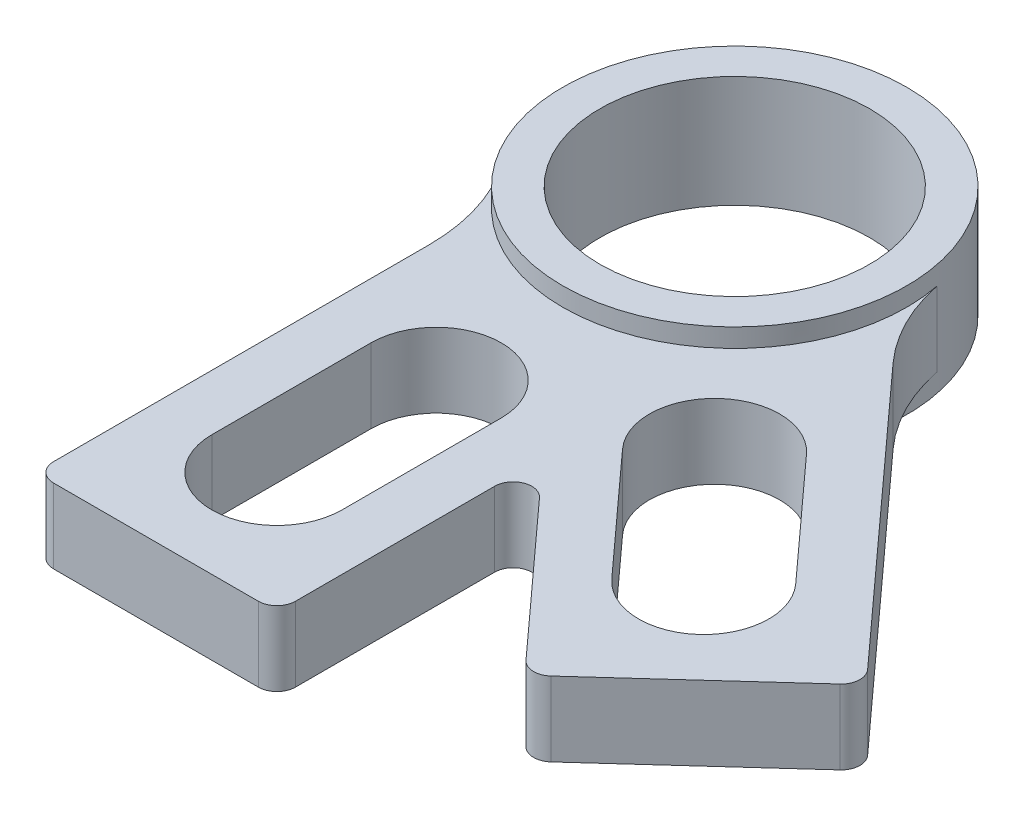
ISO-10303-21;
HEADER;
FILE_DESCRIPTION(('STEP AP214'),'2;1');
FILE_NAME('part.step','',(''),(''),'','','');
FILE_SCHEMA(('AUTOMOTIVE_DESIGN { 1 0 10303 214 1 1 1 1 }'));
ENDSEC;
DATA;
#1=APPLICATION_CONTEXT('core data for automotive mechanical design processes');
#2=APPLICATION_PROTOCOL_DEFINITION('international standard','automotive_design',2000,#1);
#3=PRODUCT_CONTEXT('',#1,'mechanical');
#4=PRODUCT('Part','Part','',(#3));
#5=PRODUCT_RELATED_PRODUCT_CATEGORY('part','',(#4));
#6=PRODUCT_DEFINITION_FORMATION('','',#4);
#7=PRODUCT_DEFINITION_CONTEXT('part definition',#1,'design');
#8=PRODUCT_DEFINITION('design','',#6,#7);
#9=PRODUCT_DEFINITION_SHAPE('','',#8);
#10=(LENGTH_UNIT() NAMED_UNIT(*) SI_UNIT(.MILLI.,.METRE.));
#11=(NAMED_UNIT(*) PLANE_ANGLE_UNIT() SI_UNIT($,.RADIAN.));
#12=(NAMED_UNIT(*) SI_UNIT($,.STERADIAN.) SOLID_ANGLE_UNIT());
#13=UNCERTAINTY_MEASURE_WITH_UNIT(LENGTH_MEASURE(1.E-05),#10,'distance_accuracy_value','');
#14=(GEOMETRIC_REPRESENTATION_CONTEXT(3) GLOBAL_UNCERTAINTY_ASSIGNED_CONTEXT((#13)) GLOBAL_UNIT_ASSIGNED_CONTEXT((#10,
#11,#12)) REPRESENTATION_CONTEXT('',''));
#15=CARTESIAN_POINT('',(0.,0.,0.));
#16=DIRECTION('',(0.,0.,1.));
#17=DIRECTION('',(1.,0.,0.));
#18=AXIS2_PLACEMENT_3D('',#15,#16,#17);
#19=CARTESIAN_POINT('',(0.,4.7625,0.));
#20=DIRECTION('',(0.,-1.,0.));
#21=DIRECTION('',(0.,0.,-1.));
#22=AXIS2_PLACEMENT_3D('',#19,#20,#21);
#23=CYLINDRICAL_SURFACE('',#22,11.5062);
#24=CARTESIAN_POINT('',(0.,4.7625,0.));
#25=DIRECTION('',(0.,1.,0.));
#26=DIRECTION('',(0.,0.,1.));
#27=AXIS2_PLACEMENT_3D('',#24,#25,#26);
#28=CIRCLE('',#27,11.5062);
#29=CARTESIAN_POINT('',(0.,4.7625,-11.5062));
#30=VERTEX_POINT('',#29);
#31=EDGE_CURVE('E301',#30,#30,#28,.T.);
#32=CARTESIAN_POINT('',(0.,-4.7625,0.));
#33=DIRECTION('',(0.,1.,0.));
#34=DIRECTION('',(0.,0.,1.));
#35=AXIS2_PLACEMENT_3D('',#32,#33,#34);
#36=CIRCLE('',#35,11.5062);
#37=CARTESIAN_POINT('',(0.,-4.7625,-11.5062));
#38=VERTEX_POINT('',#37);
#39=EDGE_CURVE('E296',#38,#38,#36,.T.);
#40=CARTESIAN_POINT('',(0.,4.7625,-11.5062));
#41=CARTESIAN_POINT('',(0.,4.66328125,-11.5062));
#42=CARTESIAN_POINT('',(0.,4.5640625,-11.5062));
#43=CARTESIAN_POINT('',(0.,4.365625,-11.5062));
#44=CARTESIAN_POINT('',(0.,4.26640625,-11.5062));
#45=CARTESIAN_POINT('',(0.,4.06796875,-11.5062));
#46=CARTESIAN_POINT('',(0.,3.96875,-11.5062));
#47=CARTESIAN_POINT('',(0.,3.7703125,-11.5062));
#48=CARTESIAN_POINT('',(0.,3.67109375,-11.5062));
#49=CARTESIAN_POINT('',(0.,3.47265625,-11.5062));
#50=CARTESIAN_POINT('',(0.,3.3734375,-11.5062));
#51=CARTESIAN_POINT('',(0.,3.175,-11.5062));
#52=CARTESIAN_POINT('',(0.,3.07578125,-11.5062));
#53=CARTESIAN_POINT('',(0.,2.87734375,-11.5062));
#54=CARTESIAN_POINT('',(0.,2.778125,-11.5062));
#55=CARTESIAN_POINT('',(0.,2.5796875,-11.5062));
#56=CARTESIAN_POINT('',(0.,2.48046875,-11.5062));
#57=CARTESIAN_POINT('',(0.,2.28203125,-11.5062));
#58=CARTESIAN_POINT('',(0.,2.1828125,-11.5062));
#59=CARTESIAN_POINT('',(0.,1.984375,-11.5062));
#60=CARTESIAN_POINT('',(0.,1.88515625,-11.5062));
#61=CARTESIAN_POINT('',(0.,1.68671875,-11.5062));
#62=CARTESIAN_POINT('',(0.,1.5875,-11.5062));
#63=CARTESIAN_POINT('',(0.,1.3890625,-11.5062));
#64=CARTESIAN_POINT('',(0.,1.28984375,-11.5062));
#65=CARTESIAN_POINT('',(0.,1.09140625,-11.5062));
#66=CARTESIAN_POINT('',(0.,0.992187499999999,-11.5062));
#67=CARTESIAN_POINT('',(0.,0.79375,-11.5062));
#68=CARTESIAN_POINT('',(0.,0.69453125,-11.5062));
#69=CARTESIAN_POINT('',(0.,0.49609375,-11.5062));
#70=CARTESIAN_POINT('',(0.,0.396875,-11.5062));
#71=CARTESIAN_POINT('',(0.,0.1984375,-11.5062));
#72=CARTESIAN_POINT('',(0.,0.0992187500000001,-11.5062));
#73=CARTESIAN_POINT('',(0.,-0.0992187500000001,-11.5062));
#74=CARTESIAN_POINT('',(0.,-0.1984375,-11.5062));
#75=CARTESIAN_POINT('',(0.,-0.396875,-11.5062));
#76=CARTESIAN_POINT('',(0.,-0.49609375,-11.5062));
#77=CARTESIAN_POINT('',(0.,-0.69453125,-11.5062));
#78=CARTESIAN_POINT('',(0.,-0.793750000000001,-11.5062));
#79=CARTESIAN_POINT('',(0.,-0.992187500000001,-11.5062));
#80=CARTESIAN_POINT('',(0.,-1.09140625,-11.5062));
#81=CARTESIAN_POINT('',(0.,-1.28984375,-11.5062));
#82=CARTESIAN_POINT('',(0.,-1.3890625,-11.5062));
#83=CARTESIAN_POINT('',(0.,-1.5875,-11.5062));
#84=CARTESIAN_POINT('',(0.,-1.68671875,-11.5062));
#85=CARTESIAN_POINT('',(0.,-1.88515625,-11.5062));
#86=CARTESIAN_POINT('',(0.,-1.984375,-11.5062));
#87=CARTESIAN_POINT('',(0.,-2.1828125,-11.5062));
#88=CARTESIAN_POINT('',(0.,-2.28203125,-11.5062));
#89=CARTESIAN_POINT('',(0.,-2.48046875,-11.5062));
#90=CARTESIAN_POINT('',(0.,-2.5796875,-11.5062));
#91=CARTESIAN_POINT('',(0.,-2.778125,-11.5062));
#92=CARTESIAN_POINT('',(0.,-2.87734375,-11.5062));
#93=CARTESIAN_POINT('',(0.,-3.07578125,-11.5062));
#94=CARTESIAN_POINT('',(0.,-3.175,-11.5062));
#95=CARTESIAN_POINT('',(0.,-3.3734375,-11.5062));
#96=CARTESIAN_POINT('',(0.,-3.47265625,-11.5062));
#97=CARTESIAN_POINT('',(0.,-3.67109375,-11.5062));
#98=CARTESIAN_POINT('',(0.,-3.7703125,-11.5062));
#99=CARTESIAN_POINT('',(0.,-3.96875,-11.5062));
#100=CARTESIAN_POINT('',(0.,-4.06796875,-11.5062));
#101=CARTESIAN_POINT('',(0.,-4.26640625,-11.5062));
#102=CARTESIAN_POINT('',(0.,-4.365625,-11.5062));
#103=CARTESIAN_POINT('',(0.,-4.5640625,-11.5062));
#104=CARTESIAN_POINT('',(0.,-4.66328125,-11.5062));
#105=CARTESIAN_POINT('',(0.,-4.7625,-11.5062));
#106=B_SPLINE_CURVE_WITH_KNOTS('',3,(#40,#41,#42,#43,#44,#45,#46,#47,#48,#49,#50,#51,#52,#53,
#54,#55,#56,#57,#58,#59,#60,#61,#62,#63,#64,#65,#66,#67,#68,#69,#70,#71,#72,#73,#74,#75,#76,#77,
#78,#79,#80,#81,#82,#83,#84,#85,#86,#87,#88,#89,#90,#91,#92,#93,#94,#95,#96,#97,#98,#99,#100,
#101,#102,#103,#104,#105),.UNSPECIFIED.,.F.,.F.,(4,2,2,2,2,2,2,2,2,2,2,2,2,2,2,2,2,2,2,2,2,2,2,
2,2,2,2,2,2,2,2,2,4),(0.,0.29765625,0.5953125,0.892968750000001,1.190625,1.48828125,1.7859375,
2.08359375,2.38125,2.67890625,2.9765625,3.27421875,3.571875,3.86953125,4.1671875,4.46484375,
4.7625,5.06015625,5.3578125,5.65546875,5.953125,6.25078125,6.5484375,6.84609375,7.14375,
7.44140625,7.7390625,8.03671875,8.334375,8.63203125,8.9296875,9.22734375,9.525),.UNSPECIFIED.);
#107=EDGE_CURVE('BSEAM43',#30,#38,#106,.T.);
#108=ORIENTED_EDGE('',*,*,#31,.T.);
#109=ORIENTED_EDGE('',*,*,#39,.F.);
#110=ORIENTED_EDGE('',*,*,#107,.T.);
#111=ORIENTED_EDGE('',*,*,#107,.F.);
#112=EDGE_LOOP('',(#108,#110,#109,#111));
#113=FACE_BOUND('',#112,.T.);
#114=ADVANCED_FACE('F43',(#113),#23,.F.);
#115=CARTESIAN_POINT('',(0.,4.7625,0.));
#116=DIRECTION('',(0.,-1.,0.));
#117=DIRECTION('',(0.,0.,-1.));
#118=AXIS2_PLACEMENT_3D('',#115,#116,#117);
#119=CYLINDRICAL_SURFACE('',#118,14.6812);
#120=DIRECTION('',(0.,-1.,0.));
#121=VECTOR('',#120,1.);
#122=CARTESIAN_POINT('',(14.3952788751418,4.7625,-2.88332785976472));
#123=LINE('',#122,#121);
#124=CARTESIAN_POINT('',(14.3952788751418,3.175,-2.88332785976472));
#125=VERTEX_POINT('',#124);
#126=CARTESIAN_POINT('',(14.3952788751418,-3.175,-2.88332785976472));
#127=VERTEX_POINT('',#126);
#128=EDGE_CURVE('E315',#125,#127,#123,.T.);
#129=ORIENTED_EDGE('',*,*,#128,.T.);
#130=CARTESIAN_POINT('',(0.,-3.175,0.));
#131=DIRECTION('',(0.,1.,0.));
#132=DIRECTION('',(0.,0.,1.));
#133=AXIS2_PLACEMENT_3D('',#130,#131,#132);
#134=CIRCLE('',#133,14.6812);
#135=CARTESIAN_POINT('',(-12.5938687913907,-3.175,7.54533646070437));
#136=VERTEX_POINT('',#135);
#137=EDGE_CURVE('E272',#136,#127,#134,.T.);
#138=ORIENTED_EDGE('',*,*,#137,.F.);
#139=DIRECTION('',(0.,-1.,0.));
#140=VECTOR('',#139,1.);
#141=CARTESIAN_POINT('',(-12.5938687913907,4.7625,7.54533646070436));
#142=LINE('',#141,#140);
#143=CARTESIAN_POINT('',(-12.5938687913907,3.175,7.54533646070437));
#144=VERTEX_POINT('',#143);
#145=EDGE_CURVE('E308',#136,#144,#142,.F.);
#146=ORIENTED_EDGE('',*,*,#145,.T.);
#147=CARTESIAN_POINT('',(0.,3.175,0.));
#148=DIRECTION('',(0.,1.,0.));
#149=DIRECTION('',(0.,0.,1.));
#150=AXIS2_PLACEMENT_3D('',#147,#148,#149);
#151=CIRCLE('',#150,14.6812);
#152=EDGE_CURVE('E234',#144,#125,#151,.T.);
#153=ORIENTED_EDGE('',*,*,#152,.T.);
#154=EDGE_LOOP('',(#129,#138,#146,#153));
#155=FACE_BOUND('',#154,.T.);
#156=CARTESIAN_POINT('',(0.,4.7625,0.));
#157=DIRECTION('',(0.,1.,0.));
#158=DIRECTION('',(0.,0.,1.));
#159=AXIS2_PLACEMENT_3D('',#156,#157,#158);
#160=CIRCLE('',#159,14.6812);
#161=CARTESIAN_POINT('',(0.,4.7625,14.6812));
#162=VERTEX_POINT('',#161);
#163=EDGE_CURVE('E304',#162,#162,#160,.T.);
#164=ORIENTED_EDGE('',*,*,#163,.F.);
#165=EDGE_LOOP('',(#164));
#166=FACE_BOUND('',#165,.T.);
#167=CARTESIAN_POINT('',(0.,-4.7625,0.));
#168=DIRECTION('',(0.,1.,0.));
#169=DIRECTION('',(0.,0.,1.));
#170=AXIS2_PLACEMENT_3D('',#167,#168,#169);
#171=CIRCLE('',#170,14.6812);
#172=CARTESIAN_POINT('',(0.,-4.7625,14.6812));
#173=VERTEX_POINT('',#172);
#174=EDGE_CURVE('E305',#173,#173,#171,.T.);
#175=ORIENTED_EDGE('',*,*,#174,.T.);
#176=EDGE_LOOP('',(#175));
#177=FACE_BOUND('',#176,.T.);
#178=ADVANCED_FACE('F411',(#155,#166,#177),#119,.T.);
#179=CARTESIAN_POINT('',(0.,4.7625,0.));
#180=DIRECTION('',(0.,1.,0.));
#181=DIRECTION('',(0.,0.,1.));
#182=AXIS2_PLACEMENT_3D('',#179,#180,#181);
#183=PLANE('',#182);
#184=ORIENTED_EDGE('',*,*,#31,.F.);
#185=EDGE_LOOP('',(#184));
#186=FACE_BOUND('',#185,.T.);
#187=ORIENTED_EDGE('',*,*,#163,.T.);
#188=EDGE_LOOP('',(#187));
#189=FACE_BOUND('',#188,.T.);
#190=ADVANCED_FACE('F447',(#186,#189),#183,.T.);
#191=CARTESIAN_POINT('',(0.,-4.7625,0.));
#192=DIRECTION('',(0.,1.,0.));
#193=DIRECTION('',(0.,0.,1.));
#194=AXIS2_PLACEMENT_3D('',#191,#192,#193);
#195=PLANE('',#194);
#196=ORIENTED_EDGE('',*,*,#39,.T.);
#197=EDGE_LOOP('',(#196));
#198=FACE_BOUND('',#197,.T.);
#199=ORIENTED_EDGE('',*,*,#174,.F.);
#200=EDGE_LOOP('',(#199));
#201=FACE_BOUND('',#200,.T.);
#202=ADVANCED_FACE('F621',(#198,#201),#195,.F.);
#203=CARTESIAN_POINT('',(-10.31875,3.175,0.));
#204=DIRECTION('',(-1.,0.,0.));
#205=DIRECTION('',(0.,0.,1.));
#206=AXIS2_PLACEMENT_3D('',#203,#204,#205);
#207=PLANE('',#206);
#208=DIRECTION('',(0.,0.,-1.));
#209=VECTOR('',#208,1.);
#210=CARTESIAN_POINT('',(-10.31875,-3.175,0.));
#211=LINE('',#210,#209);
#212=CARTESIAN_POINT('',(-10.31875,-3.175,47.8028));
#213=VERTEX_POINT('',#212);
#214=CARTESIAN_POINT('',(-10.31875,-3.175,15.7694921185655));
#215=VERTEX_POINT('',#214);
#216=EDGE_CURVE('E274',#213,#215,#211,.T.);
#217=ORIENTED_EDGE('',*,*,#216,.F.);
#218=DIRECTION('',(0.,-1.,0.));
#219=VECTOR('',#218,1.);
#220=CARTESIAN_POINT('',(-10.31875,3.175,47.8028));
#221=LINE('',#220,#219);
#222=CARTESIAN_POINT('',(-10.31875,3.175,47.8028));
#223=VERTEX_POINT('',#222);
#224=EDGE_CURVE('E374',#213,#223,#221,.F.);
#225=ORIENTED_EDGE('',*,*,#224,.T.);
#226=DIRECTION('',(0.,0.,-1.));
#227=VECTOR('',#226,1.);
#228=CARTESIAN_POINT('',(-10.31875,3.175,0.));
#229=LINE('',#228,#227);
#230=CARTESIAN_POINT('',(-10.31875,3.175,15.7694921185655));
#231=VERTEX_POINT('',#230);
#232=EDGE_CURVE('E236',#223,#231,#229,.T.);
#233=ORIENTED_EDGE('',*,*,#232,.T.);
#234=DIRECTION('',(0.,-1.,0.));
#235=VECTOR('',#234,1.);
#236=CARTESIAN_POINT('',(-10.31875,3.175,15.7694921185655));
#237=LINE('',#236,#235);
#238=EDGE_CURVE('E321',#231,#215,#237,.T.);
#239=ORIENTED_EDGE('',*,*,#238,.T.);
#240=EDGE_LOOP('',(#217,#225,#233,#239));
#241=FACE_BOUND('',#240,.T.);
#242=ADVANCED_FACE('F613',(#241),#207,.T.);
#243=CARTESIAN_POINT('',(0.,3.175,49.3903));
#244=DIRECTION('',(0.,0.,-1.));
#245=DIRECTION('',(-1.,0.,0.));
#246=AXIS2_PLACEMENT_3D('',#243,#244,#245);
#247=PLANE('',#246);
#248=DIRECTION('',(1.,0.,0.));
#249=VECTOR('',#248,1.);
#250=CARTESIAN_POINT('',(0.,-3.175,49.3903));
#251=LINE('',#250,#249);
#252=CARTESIAN_POINT('',(-8.73124999999999,-3.175,49.3903));
#253=VERTEX_POINT('',#252);
#254=CARTESIAN_POINT('',(8.73125,-3.175,49.3903));
#255=VERTEX_POINT('',#254);
#256=EDGE_CURVE('E276',#253,#255,#251,.T.);
#257=ORIENTED_EDGE('',*,*,#256,.T.);
#258=DIRECTION('',(0.,-1.,0.));
#259=VECTOR('',#258,1.);
#260=CARTESIAN_POINT('',(8.73125,3.175,49.3903));
#261=LINE('',#260,#259);
#262=CARTESIAN_POINT('',(8.73125,3.175,49.3903));
#263=VERTEX_POINT('',#262);
#264=EDGE_CURVE('E372',#255,#263,#261,.F.);
#265=ORIENTED_EDGE('',*,*,#264,.T.);
#266=DIRECTION('',(1.,0.,0.));
#267=VECTOR('',#266,1.);
#268=CARTESIAN_POINT('',(0.,3.175,49.3903));
#269=LINE('',#268,#267);
#270=CARTESIAN_POINT('',(-8.73124999999999,3.175,49.3903));
#271=VERTEX_POINT('',#270);
#272=EDGE_CURVE('E238',#271,#263,#269,.T.);
#273=ORIENTED_EDGE('',*,*,#272,.F.);
#274=DIRECTION('',(0.,-1.,0.));
#275=VECTOR('',#274,1.);
#276=CARTESIAN_POINT('',(-8.73124999999999,-3.175,49.3903));
#277=LINE('',#276,#275);
#278=EDGE_CURVE('E369',#271,#253,#277,.T.);
#279=ORIENTED_EDGE('',*,*,#278,.T.);
#280=EDGE_LOOP('',(#257,#265,#273,#279));
#281=FACE_BOUND('',#280,.T.);
#282=ADVANCED_FACE('F428',(#281),#247,.F.);
#283=CARTESIAN_POINT('',(10.31875,3.175,0.));
#284=DIRECTION('',(-1.,0.,0.));
#285=DIRECTION('',(0.,0.,1.));
#286=AXIS2_PLACEMENT_3D('',#283,#284,#285);
#287=PLANE('',#286);
#288=DIRECTION('',(0.,0.,-1.));
#289=VECTOR('',#288,1.);
#290=CARTESIAN_POINT('',(10.31875,-3.175,0.));
#291=LINE('',#290,#289);
#292=CARTESIAN_POINT('',(10.31875,-3.175,47.8028));
#293=VERTEX_POINT('',#292);
#294=CARTESIAN_POINT('',(10.31875,-3.175,30.8131060248952));
#295=VERTEX_POINT('',#294);
#296=EDGE_CURVE('E279',#293,#295,#291,.T.);
#297=ORIENTED_EDGE('',*,*,#296,.T.);
#298=DIRECTION('',(0.,-1.,0.));
#299=VECTOR('',#298,1.);
#300=CARTESIAN_POINT('',(10.31875,3.175,30.8131060248952));
#301=LINE('',#300,#299);
#302=CARTESIAN_POINT('',(10.31875,3.175,30.8131060248952));
#303=VERTEX_POINT('',#302);
#304=EDGE_CURVE('E367',#295,#303,#301,.F.);
#305=ORIENTED_EDGE('',*,*,#304,.T.);
#306=DIRECTION('',(0.,0.,-1.));
#307=VECTOR('',#306,1.);
#308=CARTESIAN_POINT('',(10.31875,3.175,0.));
#309=LINE('',#308,#307);
#310=CARTESIAN_POINT('',(10.31875,3.175,47.8028));
#311=VERTEX_POINT('',#310);
#312=EDGE_CURVE('E241',#311,#303,#309,.T.);
#313=ORIENTED_EDGE('',*,*,#312,.F.);
#314=DIRECTION('',(0.,-1.,0.));
#315=VECTOR('',#314,1.);
#316=CARTESIAN_POINT('',(10.31875,3.175,47.8028));
#317=LINE('',#316,#315);
#318=EDGE_CURVE('E364',#311,#293,#317,.T.);
#319=ORIENTED_EDGE('',*,*,#318,.T.);
#320=EDGE_LOOP('',(#297,#305,#313,#319));
#321=FACE_BOUND('',#320,.T.);
#322=ADVANCED_FACE('F383',(#321),#287,.F.);
#323=CARTESIAN_POINT('',(-7.63772897691547,3.175,6.93842184056887));
#324=DIRECTION('',(-0.740179670688365,0.,0.672409142635393));
#325=DIRECTION('',(0.672409142635393,0.,0.740179670688365));
#326=AXIS2_PLACEMENT_3D('',#323,#324,#325);
#327=PLANE('',#326);
#328=DIRECTION('',(-0.672409142635393,0.,-0.740179670688365));
#329=VECTOR('',#328,1.);
#330=CARTESIAN_POINT('',(-7.63772897691547,-3.175,6.93842184056887));
#331=LINE('',#330,#329);
#332=CARTESIAN_POINT('',(24.5053107866557,-3.175,42.3210826025506));
#333=VERTEX_POINT('',#332);
#334=CARTESIAN_POINT('',(13.0812852272178,-3.175,29.7456565109615));
#335=VERTEX_POINT('',#334);
#336=EDGE_CURVE('E282',#333,#335,#331,.T.);
#337=ORIENTED_EDGE('',*,*,#336,.F.);
#338=DIRECTION('',(0.,-1.,0.));
#339=VECTOR('',#338,1.);
#340=CARTESIAN_POINT('',(24.5053107866557,3.175,42.3210826025506));
#341=LINE('',#340,#339);
#342=CARTESIAN_POINT('',(24.5053107866557,3.175,42.3210826025506));
#343=VERTEX_POINT('',#342);
#344=EDGE_CURVE('E63',#333,#343,#341,.F.);
#345=ORIENTED_EDGE('',*,*,#344,.T.);
#346=DIRECTION('',(-0.672409142635393,0.,-0.740179670688365));
#347=VECTOR('',#346,1.);
#348=CARTESIAN_POINT('',(-7.63772897691547,3.175,6.93842184056887));
#349=LINE('',#348,#347);
#350=CARTESIAN_POINT('',(13.0812852272178,3.175,29.7456565109615));
#351=VERTEX_POINT('',#350);
#352=EDGE_CURVE('E243',#343,#351,#349,.T.);
#353=ORIENTED_EDGE('',*,*,#352,.T.);
#354=DIRECTION('',(0.,-1.,0.));
#355=VECTOR('',#354,1.);
#356=CARTESIAN_POINT('',(13.0812852272178,3.175,29.7456565109615));
#357=LINE('',#356,#355);
#358=EDGE_CURVE('E360',#351,#335,#357,.T.);
#359=ORIENTED_EDGE('',*,*,#358,.T.);
#360=EDGE_LOOP('',(#337,#345,#353,#359));
#361=FACE_BOUND('',#360,.T.);
#362=ADVANCED_FACE('F387',(#361),#327,.T.);
#363=CARTESIAN_POINT('',(33.2104892775048,3.175,36.5576959891995));
#364=DIRECTION('',(-0.672409142635393,0.,-0.740179670688365));
#365=DIRECTION('',(-0.740179670688365,0.,0.672409142635393));
#366=AXIS2_PLACEMENT_3D('',#363,#364,#365);
#367=PLANE('',#366);
#368=DIRECTION('',(0.740179670688365,0.,-0.672409142635393));
#369=VECTOR('',#368,1.);
#370=CARTESIAN_POINT('',(33.2104892775048,-3.175,36.5576959891995));
#371=LINE('',#370,#369);
#372=CARTESIAN_POINT('',(26.7477955278071,-3.175,42.4286683158347));
#373=VERTEX_POINT('',#372);
#374=CARTESIAN_POINT('',(39.6731830272027,-3.175,30.6867236625642));
#375=VERTEX_POINT('',#374);
#376=EDGE_CURVE('E285',#373,#375,#371,.T.);
#377=ORIENTED_EDGE('',*,*,#376,.T.);
#378=DIRECTION('',(0.,-1.,0.));
#379=VECTOR('',#378,1.);
#380=CARTESIAN_POINT('',(39.6731830272027,3.175,30.6867236625642));
#381=LINE('',#380,#379);
#382=CARTESIAN_POINT('',(39.6731830272027,3.175,30.6867236625642));
#383=VERTEX_POINT('',#382);
#384=EDGE_CURVE('E350',#375,#383,#381,.F.);
#385=ORIENTED_EDGE('',*,*,#384,.T.);
#386=DIRECTION('',(0.740179670688365,0.,-0.672409142635393));
#387=VECTOR('',#386,1.);
#388=CARTESIAN_POINT('',(33.2104892775048,3.175,36.5576959891995));
#389=LINE('',#388,#387);
#390=CARTESIAN_POINT('',(26.7477955278071,3.175,42.4286683158347));
#391=VERTEX_POINT('',#390);
#392=EDGE_CURVE('E245',#391,#383,#389,.T.);
#393=ORIENTED_EDGE('',*,*,#392,.F.);
#394=DIRECTION('',(0.,-1.,0.));
#395=VECTOR('',#394,1.);
#396=CARTESIAN_POINT('',(26.7477955278071,-3.175,42.4286683158347));
#397=LINE('',#396,#395);
#398=EDGE_CURVE('E347',#391,#373,#397,.T.);
#399=ORIENTED_EDGE('',*,*,#398,.T.);
#400=EDGE_LOOP('',(#377,#385,#393,#399));
#401=FACE_BOUND('',#400,.T.);
#402=ADVANCED_FACE('F395',(#401),#367,.F.);
#403=CARTESIAN_POINT('',(0.,3.175,25.48255));
#404=DIRECTION('',(0.,-1.,0.));
#405=DIRECTION('',(0.,0.,-1.));
#406=AXIS2_PLACEMENT_3D('',#403,#404,#405);
#407=CYLINDRICAL_SURFACE('',#406,5.55625);
#408=CARTESIAN_POINT('',(0.,-3.175,25.48255));
#409=DIRECTION('',(0.,1.,0.));
#410=DIRECTION('',(0.,0.,1.));
#411=AXIS2_PLACEMENT_3D('',#408,#409,#410);
#412=CIRCLE('',#411,5.55625);
#413=CARTESIAN_POINT('',(5.55625,-3.175,25.48255));
#414=VERTEX_POINT('',#413);
#415=CARTESIAN_POINT('',(-5.55624999999999,-3.175,25.48255));
#416=VERTEX_POINT('',#415);
#417=EDGE_CURVE('E260',#414,#416,#412,.T.);
#418=ORIENTED_EDGE('',*,*,#417,.F.);
#419=DIRECTION('',(0.,-1.,0.));
#420=VECTOR('',#419,1.);
#421=CARTESIAN_POINT('',(5.55625,3.175,25.48255));
#422=LINE('',#421,#420);
#423=CARTESIAN_POINT('',(5.55625,3.175,25.48255));
#424=VERTEX_POINT('',#423);
#425=EDGE_CURVE('E294',#424,#414,#422,.T.);
#426=ORIENTED_EDGE('',*,*,#425,.F.);
#427=CARTESIAN_POINT('',(0.,3.175,25.48255));
#428=DIRECTION('',(0.,1.,0.));
#429=DIRECTION('',(0.,0.,1.));
#430=AXIS2_PLACEMENT_3D('',#427,#428,#429);
#431=CIRCLE('',#430,5.55625);
#432=CARTESIAN_POINT('',(-5.55624999999999,3.175,25.48255));
#433=VERTEX_POINT('',#432);
#434=EDGE_CURVE('E223',#424,#433,#431,.T.);
#435=ORIENTED_EDGE('',*,*,#434,.T.);
#436=DIRECTION('',(0.,-1.,0.));
#437=VECTOR('',#436,1.);
#438=CARTESIAN_POINT('',(-5.55624999999999,3.175,25.48255));
#439=LINE('',#438,#437);
#440=EDGE_CURVE('E202',#433,#416,#439,.T.);
#441=ORIENTED_EDGE('',*,*,#440,.T.);
#442=EDGE_LOOP('',(#418,#426,#435,#441));
#443=FACE_BOUND('',#442,.T.);
#444=ADVANCED_FACE('F575',(#443),#407,.F.);
#445=CARTESIAN_POINT('',(5.55625,3.175,0.));
#446=DIRECTION('',(-1.,0.,0.));
#447=DIRECTION('',(0.,0.,1.));
#448=AXIS2_PLACEMENT_3D('',#445,#446,#447);
#449=PLANE('',#448);
#450=DIRECTION('',(0.,0.,-1.));
#451=VECTOR('',#450,1.);
#452=CARTESIAN_POINT('',(5.55625,-3.175,0.));
#453=LINE('',#452,#451);
#454=CARTESIAN_POINT('',(5.55625,-3.175,39.07155));
#455=VERTEX_POINT('',#454);
#456=EDGE_CURVE('E263',#455,#414,#453,.T.);
#457=ORIENTED_EDGE('',*,*,#456,.F.);
#458=DIRECTION('',(0.,-1.,0.));
#459=VECTOR('',#458,1.);
#460=CARTESIAN_POINT('',(5.55625,3.175,39.07155));
#461=LINE('',#460,#459);
#462=CARTESIAN_POINT('',(5.55625,3.175,39.07155));
#463=VERTEX_POINT('',#462);
#464=EDGE_CURVE('E292',#463,#455,#461,.T.);
#465=ORIENTED_EDGE('',*,*,#464,.F.);
#466=DIRECTION('',(0.,0.,-1.));
#467=VECTOR('',#466,1.);
#468=CARTESIAN_POINT('',(5.55625,3.175,0.));
#469=LINE('',#468,#467);
#470=EDGE_CURVE('E226',#463,#424,#469,.T.);
#471=ORIENTED_EDGE('',*,*,#470,.T.);
#472=ORIENTED_EDGE('',*,*,#425,.T.);
#473=EDGE_LOOP('',(#457,#465,#471,#472));
#474=FACE_BOUND('',#473,.T.);
#475=ADVANCED_FACE('F566',(#474),#449,.T.);
#476=CARTESIAN_POINT('',(0.,3.175,39.07155));
#477=DIRECTION('',(0.,-1.,0.));
#478=DIRECTION('',(0.,0.,-1.));
#479=AXIS2_PLACEMENT_3D('',#476,#477,#478);
#480=CYLINDRICAL_SURFACE('',#479,5.55625);
#481=CARTESIAN_POINT('',(0.,-3.175,39.07155));
#482=DIRECTION('',(0.,1.,0.));
#483=DIRECTION('',(0.,0.,1.));
#484=AXIS2_PLACEMENT_3D('',#481,#482,#483);
#485=CIRCLE('',#484,5.55625);
#486=CARTESIAN_POINT('',(-5.55625,-3.175,39.07155));
#487=VERTEX_POINT('',#486);
#488=EDGE_CURVE('E266',#487,#455,#485,.T.);
#489=ORIENTED_EDGE('',*,*,#488,.F.);
#490=DIRECTION('',(0.,-1.,0.));
#491=VECTOR('',#490,1.);
#492=CARTESIAN_POINT('',(-5.55625,3.175,39.07155));
#493=LINE('',#492,#491);
#494=CARTESIAN_POINT('',(-5.55625,3.175,39.07155));
#495=VERTEX_POINT('',#494);
#496=EDGE_CURVE('E290',#495,#487,#493,.T.);
#497=ORIENTED_EDGE('',*,*,#496,.F.);
#498=CARTESIAN_POINT('',(0.,3.175,39.07155));
#499=DIRECTION('',(0.,1.,0.));
#500=DIRECTION('',(0.,0.,1.));
#501=AXIS2_PLACEMENT_3D('',#498,#499,#500);
#502=CIRCLE('',#501,5.55625);
#503=EDGE_CURVE('E229',#495,#463,#502,.T.);
#504=ORIENTED_EDGE('',*,*,#503,.T.);
#505=ORIENTED_EDGE('',*,*,#464,.T.);
#506=EDGE_LOOP('',(#489,#497,#504,#505));
#507=FACE_BOUND('',#506,.T.);
#508=ADVANCED_FACE('F558',(#507),#480,.F.);
#509=CARTESIAN_POINT('',(17.1346995976636,3.175,18.8616654672997));
#510=DIRECTION('',(0.,-1.,0.));
#511=DIRECTION('',(0.,0.,-1.));
#512=AXIS2_PLACEMENT_3D('',#509,#510,#511);
#513=CYLINDRICAL_SURFACE('',#512,5.55624999999999);
#514=CARTESIAN_POINT('',(17.1346995976636,-3.175,18.8616654672997));
#515=DIRECTION('',(0.,1.,0.));
#516=DIRECTION('',(0.,0.,1.));
#517=AXIS2_PLACEMENT_3D('',#514,#515,#516);
#518=CIRCLE('',#517,5.55624999999999);
#519=CARTESIAN_POINT('',(21.2473228929258,-3.175,15.1255921685318));
#520=VERTEX_POINT('',#519);
#521=CARTESIAN_POINT('',(13.0220763024014,-3.175,22.5977387660676));
#522=VERTEX_POINT('',#521);
#523=EDGE_CURVE('E197',#520,#522,#518,.T.);
#524=ORIENTED_EDGE('',*,*,#523,.F.);
#525=DIRECTION('',(0.,-1.,0.));
#526=VECTOR('',#525,1.);
#527=CARTESIAN_POINT('',(21.2473228929258,3.175,15.1255921685318));
#528=LINE('',#527,#526);
#529=CARTESIAN_POINT('',(21.2473228929258,3.175,15.1255921685318));
#530=VERTEX_POINT('',#529);
#531=EDGE_CURVE('E192',#530,#520,#528,.T.);
#532=ORIENTED_EDGE('',*,*,#531,.F.);
#533=CARTESIAN_POINT('',(17.1346995976636,3.175,18.8616654672997));
#534=DIRECTION('',(0.,1.,0.));
#535=DIRECTION('',(0.,0.,1.));
#536=AXIS2_PLACEMENT_3D('',#533,#534,#535);
#537=CIRCLE('',#536,5.55624999999999);
#538=CARTESIAN_POINT('',(13.0220763024014,3.175,22.5977387660676));
#539=VERTEX_POINT('',#538);
#540=EDGE_CURVE('E195',#530,#539,#537,.T.);
#541=ORIENTED_EDGE('',*,*,#540,.T.);
#542=DIRECTION('',(0.,-1.,0.));
#543=VECTOR('',#542,1.);
#544=CARTESIAN_POINT('',(13.0220763024014,3.175,22.5977387660676));
#545=LINE('',#544,#543);
#546=EDGE_CURVE('E250',#539,#522,#545,.T.);
#547=ORIENTED_EDGE('',*,*,#546,.T.);
#548=EDGE_LOOP('',(#524,#532,#541,#547));
#549=FACE_BOUND('',#548,.T.);
#550=ADVANCED_FACE('F194',(#549),#513,.F.);
#551=CARTESIAN_POINT('',(4.11262329526231,3.175,-3.73607329876798));
#552=DIRECTION('',(-0.740179670688364,0.,0.672409142635393));
#553=DIRECTION('',(0.672409142635393,0.,0.740179670688364));
#554=AXIS2_PLACEMENT_3D('',#551,#552,#553);
#555=PLANE('',#554);
#556=DIRECTION('',(-0.672409142635393,0.,-0.740179670688364));
#557=VECTOR('',#556,1.);
#558=CARTESIAN_POINT('',(4.11262329526231,-3.175,-3.73607329876798));
#559=LINE('',#558,#557);
#560=CARTESIAN_POINT('',(30.3846907321982,-3.175,25.183893713516));
#561=VERTEX_POINT('',#560);
#562=EDGE_CURVE('E252',#561,#520,#559,.T.);
#563=ORIENTED_EDGE('',*,*,#562,.F.);
#564=DIRECTION('',(0.,-1.,0.));
#565=VECTOR('',#564,1.);
#566=CARTESIAN_POINT('',(30.3846907321982,3.175,25.183893713516));
#567=LINE('',#566,#565);
#568=CARTESIAN_POINT('',(30.3846907321982,3.175,25.183893713516));
#569=VERTEX_POINT('',#568);
#570=EDGE_CURVE('E203',#569,#561,#567,.T.);
#571=ORIENTED_EDGE('',*,*,#570,.F.);
#572=DIRECTION('',(-0.672409142635393,0.,-0.740179670688364));
#573=VECTOR('',#572,1.);
#574=CARTESIAN_POINT('',(4.11262329526231,3.175,-3.73607329876798));
#575=LINE('',#574,#573);
#576=EDGE_CURVE('E210',#569,#530,#575,.T.);
#577=ORIENTED_EDGE('',*,*,#576,.T.);
#578=ORIENTED_EDGE('',*,*,#531,.T.);
#579=EDGE_LOOP('',(#563,#571,#577,#578));
#580=FACE_BOUND('',#579,.T.);
#581=ADVANCED_FACE('F217',(#580),#555,.T.);
#582=CARTESIAN_POINT('',(26.272067436936,3.175,28.9199670122839));
#583=DIRECTION('',(0.,-1.,0.));
#584=DIRECTION('',(0.,0.,-1.));
#585=AXIS2_PLACEMENT_3D('',#582,#583,#584);
#586=CYLINDRICAL_SURFACE('',#585,5.55625);
#587=CARTESIAN_POINT('',(26.272067436936,-3.175,28.9199670122839));
#588=DIRECTION('',(0.,1.,0.));
#589=DIRECTION('',(0.,0.,1.));
#590=AXIS2_PLACEMENT_3D('',#587,#588,#589);
#591=CIRCLE('',#590,5.55625);
#592=CARTESIAN_POINT('',(22.1594441416738,-3.175,32.6560403110518));
#593=VERTEX_POINT('',#592);
#594=EDGE_CURVE('E254',#593,#561,#591,.T.);
#595=ORIENTED_EDGE('',*,*,#594,.F.);
#596=DIRECTION('',(0.,-1.,0.));
#597=VECTOR('',#596,1.);
#598=CARTESIAN_POINT('',(22.1594441416738,3.175,32.6560403110518));
#599=LINE('',#598,#597);
#600=CARTESIAN_POINT('',(22.1594441416738,3.175,32.6560403110518));
#601=VERTEX_POINT('',#600);
#602=EDGE_CURVE('E298',#601,#593,#599,.T.);
#603=ORIENTED_EDGE('',*,*,#602,.F.);
#604=CARTESIAN_POINT('',(26.272067436936,3.175,28.9199670122839));
#605=DIRECTION('',(0.,1.,0.));
#606=DIRECTION('',(0.,0.,1.));
#607=AXIS2_PLACEMENT_3D('',#604,#605,#606);
#608=CIRCLE('',#607,5.55625);
#609=EDGE_CURVE('E218',#601,#569,#608,.T.);
#610=ORIENTED_EDGE('',*,*,#609,.T.);
#611=ORIENTED_EDGE('',*,*,#570,.T.);
#612=EDGE_LOOP('',(#595,#603,#610,#611));
#613=FACE_BOUND('',#612,.T.);
#614=ADVANCED_FACE('F534',(#613),#586,.F.);
#615=CARTESIAN_POINT('',(-5.55624999999999,3.175,0.));
#616=DIRECTION('',(-1.,0.,0.));
#617=DIRECTION('',(0.,0.,1.));
#618=AXIS2_PLACEMENT_3D('',#615,#616,#617);
#619=PLANE('',#618);
#620=DIRECTION('',(0.,0.,-1.));
#621=VECTOR('',#620,1.);
#622=CARTESIAN_POINT('',(-5.55624999999999,-3.175,0.));
#623=LINE('',#622,#621);
#624=EDGE_CURVE('E269',#487,#416,#623,.T.);
#625=ORIENTED_EDGE('',*,*,#624,.T.);
#626=ORIENTED_EDGE('',*,*,#440,.F.);
#627=DIRECTION('',(0.,0.,-1.));
#628=VECTOR('',#627,1.);
#629=CARTESIAN_POINT('',(-5.55624999999999,3.175,0.));
#630=LINE('',#629,#628);
#631=EDGE_CURVE('E232',#495,#433,#630,.T.);
#632=ORIENTED_EDGE('',*,*,#631,.F.);
#633=ORIENTED_EDGE('',*,*,#496,.T.);
#634=EDGE_LOOP('',(#625,#626,#632,#633));
#635=FACE_BOUND('',#634,.T.);
#636=ADVANCED_FACE('F525',(#635),#619,.F.);
#637=CARTESIAN_POINT('',(-4.11262329526211,3.175,3.73607329876779));
#638=DIRECTION('',(-0.740179670688365,0.,0.672409142635392));
#639=DIRECTION('',(0.672409142635392,0.,0.740179670688365));
#640=AXIS2_PLACEMENT_3D('',#637,#638,#639);
#641=PLANE('',#640);
#642=DIRECTION('',(-0.672409142635392,0.,-0.740179670688365));
#643=VECTOR('',#642,1.);
#644=CARTESIAN_POINT('',(-4.11262329526211,-3.175,3.73607329876779));
#645=LINE('',#644,#643);
#646=EDGE_CURVE('E257',#593,#522,#645,.T.);
#647=ORIENTED_EDGE('',*,*,#646,.T.);
#648=ORIENTED_EDGE('',*,*,#546,.F.);
#649=DIRECTION('',(-0.672409142635392,0.,-0.740179670688365));
#650=VECTOR('',#649,1.);
#651=CARTESIAN_POINT('',(-4.11262329526211,3.175,3.73607329876779));
#652=LINE('',#651,#650);
#653=EDGE_CURVE('E213',#601,#539,#652,.T.);
#654=ORIENTED_EDGE('',*,*,#653,.F.);
#655=ORIENTED_EDGE('',*,*,#602,.T.);
#656=EDGE_LOOP('',(#647,#648,#654,#655));
#657=FACE_BOUND('',#656,.T.);
#658=ADVANCED_FACE('F517',(#657),#641,.F.);
#659=CARTESIAN_POINT('',(7.63772897691566,3.175,-6.93842184056905));
#660=DIRECTION('',(-0.740179670688365,0.,0.672409142635393));
#661=DIRECTION('',(0.672409142635393,0.,0.740179670688365));
#662=AXIS2_PLACEMENT_3D('',#659,#660,#661);
#663=PLANE('',#662);
#664=DIRECTION('',(-0.672409142635393,0.,-0.740179670688365));
#665=VECTOR('',#664,1.);
#666=CARTESIAN_POINT('',(7.63772897691566,3.175,-6.93842184056905));
#667=LINE('',#666,#665);
#668=CARTESIAN_POINT('',(39.7807687404868,3.175,28.4442389214127));
#669=VERTEX_POINT('',#668);
#670=CARTESIAN_POINT('',(18.2412796521557,3.175,4.73383564267337));
#671=VERTEX_POINT('',#670);
#672=EDGE_CURVE('E248',#669,#671,#667,.T.);
#673=ORIENTED_EDGE('',*,*,#672,.F.);
#674=DIRECTION('',(0.,-1.,0.));
#675=VECTOR('',#674,1.);
#676=CARTESIAN_POINT('',(39.7807687404868,3.175,28.4442389214127));
#677=LINE('',#676,#675);
#678=CARTESIAN_POINT('',(39.7807687404868,-3.175,28.4442389214127));
#679=VERTEX_POINT('',#678);
#680=EDGE_CURVE('E336',#669,#679,#677,.T.);
#681=ORIENTED_EDGE('',*,*,#680,.T.);
#682=DIRECTION('',(-0.672409142635393,0.,-0.740179670688365));
#683=VECTOR('',#682,1.);
#684=CARTESIAN_POINT('',(7.63772897691566,-3.175,-6.93842184056905));
#685=LINE('',#684,#683);
#686=CARTESIAN_POINT('',(18.2412796521557,-3.175,4.73383564267337));
#687=VERTEX_POINT('',#686);
#688=EDGE_CURVE('E215',#679,#687,#685,.T.);
#689=ORIENTED_EDGE('',*,*,#688,.T.);
#690=DIRECTION('',(0.,1.,0.));
#691=VECTOR('',#690,1.);
#692=CARTESIAN_POINT('',(18.2412796521557,3.175,4.73383564267337));
#693=LINE('',#692,#691);
#694=EDGE_CURVE('E318',#687,#671,#693,.T.);
#695=ORIENTED_EDGE('',*,*,#694,.T.);
#696=EDGE_LOOP('',(#673,#681,#689,#695));
#697=FACE_BOUND('',#696,.T.);
#698=ADVANCED_FACE('F403',(#697),#663,.F.);
#699=CARTESIAN_POINT('',(0.,3.175,0.));
#700=DIRECTION('',(0.,1.,0.));
#701=DIRECTION('',(0.,0.,1.));
#702=AXIS2_PLACEMENT_3D('',#699,#700,#701);
#703=PLANE('',#702);
#704=ORIENTED_EDGE('',*,*,#540,.F.);
#705=ORIENTED_EDGE('',*,*,#576,.F.);
#706=ORIENTED_EDGE('',*,*,#609,.F.);
#707=ORIENTED_EDGE('',*,*,#653,.T.);
#708=EDGE_LOOP('',(#704,#705,#706,#707));
#709=FACE_BOUND('',#708,.T.);
#710=ORIENTED_EDGE('',*,*,#434,.F.);
#711=ORIENTED_EDGE('',*,*,#470,.F.);
#712=ORIENTED_EDGE('',*,*,#503,.F.);
#713=ORIENTED_EDGE('',*,*,#631,.T.);
#714=EDGE_LOOP('',(#710,#711,#712,#713));
#715=FACE_BOUND('',#714,.T.);
#716=ORIENTED_EDGE('',*,*,#392,.T.);
#717=CARTESIAN_POINT('',(38.605733513269,3.175,29.5116884353464));
#718=DIRECTION('',(0.,1.,0.));
#719=DIRECTION('',(0.,0.,1.));
#720=AXIS2_PLACEMENT_3D('',#717,#718,#719);
#721=CIRCLE('',#720,1.5875);
#722=EDGE_CURVE('E358',#383,#669,#721,.T.);
#723=ORIENTED_EDGE('',*,*,#722,.T.);
#724=ORIENTED_EDGE('',*,*,#672,.T.);
#725=CARTESIAN_POINT('',(30.0856347425109,3.175,-6.02605545777818));
#726=DIRECTION('',(0.,1.,0.));
#727=DIRECTION('',(0.,0.,1.));
#728=AXIS2_PLACEMENT_3D('',#725,#726,#727);
#729=CIRCLE('',#728,16.002);
#730=EDGE_CURVE('E327',#671,#125,#729,.F.);
#731=ORIENTED_EDGE('',*,*,#730,.T.);
#732=ORIENTED_EDGE('',*,*,#152,.F.);
#733=CARTESIAN_POINT('',(-26.32075,3.175,15.7694921185655));
#734=DIRECTION('',(0.,1.,0.));
#735=DIRECTION('',(0.,0.,1.));
#736=AXIS2_PLACEMENT_3D('',#733,#734,#735);
#737=CIRCLE('',#736,16.002);
#738=EDGE_CURVE('E333',#144,#231,#737,.F.);
#739=ORIENTED_EDGE('',*,*,#738,.T.);
#740=ORIENTED_EDGE('',*,*,#232,.F.);
#741=CARTESIAN_POINT('',(-8.73124999999999,3.175,47.8028));
#742=DIRECTION('',(0.,1.,0.));
#743=DIRECTION('',(0.,0.,1.));
#744=AXIS2_PLACEMENT_3D('',#741,#742,#743);
#745=CIRCLE('',#744,1.5875);
#746=EDGE_CURVE('E352',#223,#271,#745,.T.);
#747=ORIENTED_EDGE('',*,*,#746,.T.);
#748=ORIENTED_EDGE('',*,*,#272,.T.);
#749=CARTESIAN_POINT('',(8.73125,3.175,47.8028));
#750=DIRECTION('',(0.,1.,0.));
#751=DIRECTION('',(0.,0.,1.));
#752=AXIS2_PLACEMENT_3D('',#749,#750,#751);
#753=CIRCLE('',#752,1.5875);
#754=EDGE_CURVE('E354',#263,#311,#753,.T.);
#755=ORIENTED_EDGE('',*,*,#754,.T.);
#756=ORIENTED_EDGE('',*,*,#312,.T.);
#757=CARTESIAN_POINT('',(11.90625,3.175,30.8131060248952));
#758=DIRECTION('',(0.,1.,0.));
#759=DIRECTION('',(0.,0.,1.));
#760=AXIS2_PLACEMENT_3D('',#757,#758,#759);
#761=CIRCLE('',#760,1.5875);
#762=EDGE_CURVE('E11',#303,#351,#761,.F.);
#763=ORIENTED_EDGE('',*,*,#762,.T.);
#764=ORIENTED_EDGE('',*,*,#352,.F.);
#765=CARTESIAN_POINT('',(25.6803460138735,3.175,41.2536330886169));
#766=DIRECTION('',(0.,1.,0.));
#767=DIRECTION('',(0.,0.,1.));
#768=AXIS2_PLACEMENT_3D('',#765,#766,#767);
#769=CIRCLE('',#768,1.5875);
#770=EDGE_CURVE('E356',#343,#391,#769,.T.);
#771=ORIENTED_EDGE('',*,*,#770,.T.);
#772=EDGE_LOOP('',(#716,#723,#724,#731,#732,#739,#740,#747,#748,#755,#756,#763,#764,#771));
#773=FACE_BOUND('',#772,.T.);
#774=ADVANCED_FACE('F207',(#709,#715,#773),#703,.T.);
#775=CARTESIAN_POINT('',(0.,-3.175,0.));
#776=DIRECTION('',(0.,1.,0.));
#777=DIRECTION('',(0.,0.,1.));
#778=AXIS2_PLACEMENT_3D('',#775,#776,#777);
#779=PLANE('',#778);
#780=ORIENTED_EDGE('',*,*,#523,.T.);
#781=ORIENTED_EDGE('',*,*,#646,.F.);
#782=ORIENTED_EDGE('',*,*,#594,.T.);
#783=ORIENTED_EDGE('',*,*,#562,.T.);
#784=EDGE_LOOP('',(#780,#781,#782,#783));
#785=FACE_BOUND('',#784,.T.);
#786=ORIENTED_EDGE('',*,*,#417,.T.);
#787=ORIENTED_EDGE('',*,*,#624,.F.);
#788=ORIENTED_EDGE('',*,*,#488,.T.);
#789=ORIENTED_EDGE('',*,*,#456,.T.);
#790=EDGE_LOOP('',(#786,#787,#788,#789));
#791=FACE_BOUND('',#790,.T.);
#792=ORIENTED_EDGE('',*,*,#688,.F.);
#793=CARTESIAN_POINT('',(38.605733513269,-3.175,29.5116884353464));
#794=DIRECTION('',(0.,1.,0.));
#795=DIRECTION('',(0.,0.,1.));
#796=AXIS2_PLACEMENT_3D('',#793,#794,#795);
#797=CIRCLE('',#796,1.5875);
#798=EDGE_CURVE('E345',#679,#375,#797,.F.);
#799=ORIENTED_EDGE('',*,*,#798,.T.);
#800=ORIENTED_EDGE('',*,*,#376,.F.);
#801=CARTESIAN_POINT('',(25.6803460138735,-3.175,41.2536330886169));
#802=DIRECTION('',(0.,1.,0.));
#803=DIRECTION('',(0.,0.,1.));
#804=AXIS2_PLACEMENT_3D('',#801,#802,#803);
#805=CIRCLE('',#804,1.5875);
#806=EDGE_CURVE('E343',#373,#333,#805,.F.);
#807=ORIENTED_EDGE('',*,*,#806,.T.);
#808=ORIENTED_EDGE('',*,*,#336,.T.);
#809=CARTESIAN_POINT('',(11.90625,-3.175,30.8131060248952));
#810=DIRECTION('',(0.,1.,0.));
#811=DIRECTION('',(0.,0.,1.));
#812=AXIS2_PLACEMENT_3D('',#809,#810,#811);
#813=CIRCLE('',#812,1.5875);
#814=EDGE_CURVE('E51',#335,#295,#813,.T.);
#815=ORIENTED_EDGE('',*,*,#814,.T.);
#816=ORIENTED_EDGE('',*,*,#296,.F.);
#817=CARTESIAN_POINT('',(8.73125,-3.175,47.8028));
#818=DIRECTION('',(0.,1.,0.));
#819=DIRECTION('',(0.,0.,1.));
#820=AXIS2_PLACEMENT_3D('',#817,#818,#819);
#821=CIRCLE('',#820,1.5875);
#822=EDGE_CURVE('E341',#293,#255,#821,.F.);
#823=ORIENTED_EDGE('',*,*,#822,.T.);
#824=ORIENTED_EDGE('',*,*,#256,.F.);
#825=CARTESIAN_POINT('',(-8.73124999999999,-3.175,47.8028));
#826=DIRECTION('',(0.,1.,0.));
#827=DIRECTION('',(0.,0.,1.));
#828=AXIS2_PLACEMENT_3D('',#825,#826,#827);
#829=CIRCLE('',#828,1.5875);
#830=EDGE_CURVE('E339',#253,#213,#829,.F.);
#831=ORIENTED_EDGE('',*,*,#830,.T.);
#832=ORIENTED_EDGE('',*,*,#216,.T.);
#833=CARTESIAN_POINT('',(-26.32075,-3.175,15.7694921185655));
#834=DIRECTION('',(0.,1.,0.));
#835=DIRECTION('',(0.,0.,1.));
#836=AXIS2_PLACEMENT_3D('',#833,#834,#835);
#837=CIRCLE('',#836,16.002);
#838=EDGE_CURVE('E330',#215,#136,#837,.T.);
#839=ORIENTED_EDGE('',*,*,#838,.T.);
#840=ORIENTED_EDGE('',*,*,#137,.T.);
#841=CARTESIAN_POINT('',(30.0856347425109,-3.175,-6.02605545777818));
#842=DIRECTION('',(0.,1.,0.));
#843=DIRECTION('',(0.,0.,1.));
#844=AXIS2_PLACEMENT_3D('',#841,#842,#843);
#845=CIRCLE('',#844,16.002);
#846=EDGE_CURVE('E324',#127,#687,#845,.T.);
#847=ORIENTED_EDGE('',*,*,#846,.T.);
#848=EDGE_LOOP('',(#792,#799,#800,#807,#808,#815,#816,#823,#824,#831,#832,#839,#840,#847));
#849=FACE_BOUND('',#848,.T.);
#850=ADVANCED_FACE('F378',(#785,#791,#849),#779,.F.);
#851=CARTESIAN_POINT('',(30.0856347425109,4.7625,-6.02605545777818));
#852=DIRECTION('',(0.,-1.,0.));
#853=DIRECTION('',(0.,0.,-1.));
#854=AXIS2_PLACEMENT_3D('',#851,#852,#853);
#855=CYLINDRICAL_SURFACE('',#854,16.002);
#856=ORIENTED_EDGE('',*,*,#730,.F.);
#857=ORIENTED_EDGE('',*,*,#694,.F.);
#858=ORIENTED_EDGE('',*,*,#846,.F.);
#859=ORIENTED_EDGE('',*,*,#128,.F.);
#860=EDGE_LOOP('',(#856,#857,#858,#859));
#861=FACE_BOUND('',#860,.T.);
#862=ADVANCED_FACE('F409',(#861),#855,.F.);
#863=CARTESIAN_POINT('',(-26.32075,4.7625,15.7694921185655));
#864=DIRECTION('',(0.,-1.,0.));
#865=DIRECTION('',(0.,0.,-1.));
#866=AXIS2_PLACEMENT_3D('',#863,#864,#865);
#867=CYLINDRICAL_SURFACE('',#866,16.002);
#868=ORIENTED_EDGE('',*,*,#738,.F.);
#869=ORIENTED_EDGE('',*,*,#145,.F.);
#870=ORIENTED_EDGE('',*,*,#838,.F.);
#871=ORIENTED_EDGE('',*,*,#238,.F.);
#872=EDGE_LOOP('',(#868,#869,#870,#871));
#873=FACE_BOUND('',#872,.T.);
#874=ADVANCED_FACE('F418',(#873),#867,.F.);
#875=CARTESIAN_POINT('',(38.605733513269,3.175,29.5116884353464));
#876=DIRECTION('',(0.,-1.,0.));
#877=DIRECTION('',(0.,0.,-1.));
#878=AXIS2_PLACEMENT_3D('',#875,#876,#877);
#879=CYLINDRICAL_SURFACE('',#878,1.5875);
#880=ORIENTED_EDGE('',*,*,#722,.F.);
#881=ORIENTED_EDGE('',*,*,#384,.F.);
#882=ORIENTED_EDGE('',*,*,#798,.F.);
#883=ORIENTED_EDGE('',*,*,#680,.F.);
#884=EDGE_LOOP('',(#880,#881,#882,#883));
#885=FACE_BOUND('',#884,.T.);
#886=ADVANCED_FACE('F400',(#885),#879,.T.);
#887=CARTESIAN_POINT('',(25.6803460138735,3.175,41.2536330886169));
#888=DIRECTION('',(0.,1.,0.));
#889=DIRECTION('',(0.,0.,1.));
#890=AXIS2_PLACEMENT_3D('',#887,#888,#889);
#891=CYLINDRICAL_SURFACE('',#890,1.5875);
#892=ORIENTED_EDGE('',*,*,#770,.F.);
#893=ORIENTED_EDGE('',*,*,#344,.F.);
#894=ORIENTED_EDGE('',*,*,#806,.F.);
#895=ORIENTED_EDGE('',*,*,#398,.F.);
#896=EDGE_LOOP('',(#892,#893,#894,#895));
#897=FACE_BOUND('',#896,.T.);
#898=ADVANCED_FACE('F392',(#897),#891,.T.);
#899=CARTESIAN_POINT('',(11.90625,3.175,30.8131060248952));
#900=DIRECTION('',(0.,-1.,0.));
#901=DIRECTION('',(0.,0.,-1.));
#902=AXIS2_PLACEMENT_3D('',#899,#900,#901);
#903=CYLINDRICAL_SURFACE('',#902,1.5875);
#904=ORIENTED_EDGE('',*,*,#762,.F.);
#905=ORIENTED_EDGE('',*,*,#304,.F.);
#906=ORIENTED_EDGE('',*,*,#814,.F.);
#907=ORIENTED_EDGE('',*,*,#358,.F.);
#908=EDGE_LOOP('',(#904,#905,#906,#907));
#909=FACE_BOUND('',#908,.T.);
#910=ADVANCED_FACE('F386',(#909),#903,.F.);
#911=CARTESIAN_POINT('',(8.73125,3.175,47.8028));
#912=DIRECTION('',(0.,-1.,0.));
#913=DIRECTION('',(0.,0.,-1.));
#914=AXIS2_PLACEMENT_3D('',#911,#912,#913);
#915=CYLINDRICAL_SURFACE('',#914,1.5875);
#916=ORIENTED_EDGE('',*,*,#754,.F.);
#917=ORIENTED_EDGE('',*,*,#264,.F.);
#918=ORIENTED_EDGE('',*,*,#822,.F.);
#919=ORIENTED_EDGE('',*,*,#318,.F.);
#920=EDGE_LOOP('',(#916,#917,#918,#919));
#921=FACE_BOUND('',#920,.T.);
#922=ADVANCED_FACE('F433',(#921),#915,.T.);
#923=CARTESIAN_POINT('',(-8.73124999999999,3.175,47.8028));
#924=DIRECTION('',(0.,1.,0.));
#925=DIRECTION('',(0.,0.,1.));
#926=AXIS2_PLACEMENT_3D('',#923,#924,#925);
#927=CYLINDRICAL_SURFACE('',#926,1.5875);
#928=ORIENTED_EDGE('',*,*,#746,.F.);
#929=ORIENTED_EDGE('',*,*,#224,.F.);
#930=ORIENTED_EDGE('',*,*,#830,.F.);
#931=ORIENTED_EDGE('',*,*,#278,.F.);
#932=EDGE_LOOP('',(#928,#929,#930,#931));
#933=FACE_BOUND('',#932,.T.);
#934=ADVANCED_FACE('F45',(#933),#927,.T.);
#935=CLOSED_SHELL('',(#114,#178,#190,#202,#242,#282,#322,#362,#402,#444,#475,#508,#550,#581,
#614,#636,#658,#698,#774,#850,#862,#874,#886,#898,#910,#922,#934));
#936=MANIFOLD_SOLID_BREP('B2',#935);
#937=ADVANCED_BREP_SHAPE_REPRESENTATION('',(#18,#936),#14);
#938=SHAPE_DEFINITION_REPRESENTATION(#9,#937);
ENDSEC;
END-ISO-10303-21;
